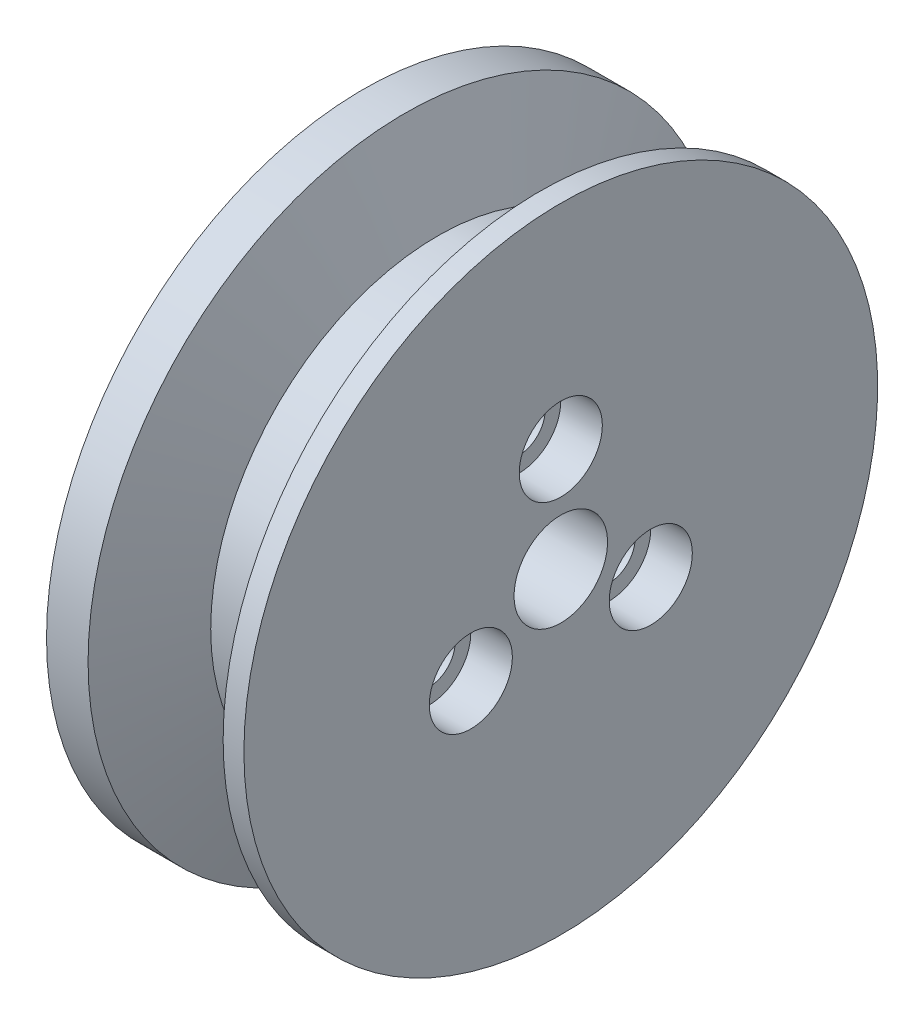
ISO-10303-21;
HEADER;
FILE_DESCRIPTION(('STEP AP214'),'2;1');
FILE_NAME('part.step','',(''),(''),'','','');
FILE_SCHEMA(('AUTOMOTIVE_DESIGN { 1 0 10303 214 1 1 1 1 }'));
ENDSEC;
DATA;
#1=APPLICATION_CONTEXT('core data for automotive mechanical design processes');
#2=APPLICATION_PROTOCOL_DEFINITION('international standard','automotive_design',2000,#1);
#3=PRODUCT_CONTEXT('',#1,'mechanical');
#4=PRODUCT('Part','Part','',(#3));
#5=PRODUCT_RELATED_PRODUCT_CATEGORY('part','',(#4));
#6=PRODUCT_DEFINITION_FORMATION('','',#4);
#7=PRODUCT_DEFINITION_CONTEXT('part definition',#1,'design');
#8=PRODUCT_DEFINITION('design','',#6,#7);
#9=PRODUCT_DEFINITION_SHAPE('','',#8);
#10=(LENGTH_UNIT() NAMED_UNIT(*) SI_UNIT(.MILLI.,.METRE.));
#11=(NAMED_UNIT(*) PLANE_ANGLE_UNIT() SI_UNIT($,.RADIAN.));
#12=(NAMED_UNIT(*) SI_UNIT($,.STERADIAN.) SOLID_ANGLE_UNIT());
#13=UNCERTAINTY_MEASURE_WITH_UNIT(LENGTH_MEASURE(1.E-05),#10,'distance_accuracy_value','');
#14=(GEOMETRIC_REPRESENTATION_CONTEXT(3) GLOBAL_UNCERTAINTY_ASSIGNED_CONTEXT((#13)) GLOBAL_UNIT_ASSIGNED_CONTEXT((#10,
#11,#12)) REPRESENTATION_CONTEXT('',''));
#15=CARTESIAN_POINT('',(0.,0.,0.));
#16=DIRECTION('',(0.,0.,1.));
#17=DIRECTION('',(1.,0.,0.));
#18=AXIS2_PLACEMENT_3D('',#15,#16,#17);
#19=CARTESIAN_POINT('',(-8.24999999999999,21.05,28.));
#20=DIRECTION('',(-1.,0.,0.));
#21=DIRECTION('',(0.,0.,1.));
#22=AXIS2_PLACEMENT_3D('',#19,#20,#21);
#23=CYLINDRICAL_SURFACE('',#22,2.25);
#24=CARTESIAN_POINT('',(-2.5,21.05,28.));
#25=DIRECTION('',(-1.,0.,0.));
#26=DIRECTION('',(0.,0.,1.));
#27=AXIS2_PLACEMENT_3D('',#24,#25,#26);
#28=CIRCLE('',#27,2.25);
#29=CARTESIAN_POINT('',(-2.5,21.05,30.25));
#30=VERTEX_POINT('',#29);
#31=EDGE_CURVE('E10',#30,#30,#28,.T.);
#32=ORIENTED_EDGE('',*,*,#31,.F.);
#33=EDGE_LOOP('',(#32));
#34=FACE_BOUND('',#33,.T.);
#35=CARTESIAN_POINT('',(-8.24999999999999,21.05,28.));
#36=DIRECTION('',(-1.,0.,0.));
#37=DIRECTION('',(0.,0.,1.));
#38=AXIS2_PLACEMENT_3D('',#35,#36,#37);
#39=CIRCLE('',#38,2.25);
#40=CARTESIAN_POINT('',(-8.24999999999999,21.05,30.25));
#41=VERTEX_POINT('',#40);
#42=EDGE_CURVE('E57',#41,#41,#39,.T.);
#43=ORIENTED_EDGE('',*,*,#42,.T.);
#44=EDGE_LOOP('',(#43));
#45=FACE_BOUND('',#44,.T.);
#46=ADVANCED_FACE('F39',(#34,#45),#23,.F.);
#47=CARTESIAN_POINT('',(-2.5,21.05,25.75));
#48=DIRECTION('',(-1.,0.,0.));
#49=DIRECTION('',(0.,0.,1.));
#50=AXIS2_PLACEMENT_3D('',#47,#48,#49);
#51=PLANE('',#50);
#52=CARTESIAN_POINT('',(-2.49999999999999,26.05,28.));
#53=DIRECTION('',(1.,0.,0.));
#54=DIRECTION('',(0.,0.,-1.));
#55=AXIS2_PLACEMENT_3D('',#52,#53,#54);
#56=CIRCLE('',#55,2.);
#57=CARTESIAN_POINT('',(-2.49999999999999,26.05,26.));
#58=VERTEX_POINT('',#57);
#59=EDGE_CURVE('E206',#58,#58,#56,.T.);
#60=ORIENTED_EDGE('',*,*,#59,.F.);
#61=EDGE_LOOP('',(#60));
#62=FACE_BOUND('',#61,.T.);
#63=CARTESIAN_POINT('',(-2.49999999999999,18.55,23.6698729810778));
#64=DIRECTION('',(1.,0.,0.));
#65=DIRECTION('',(0.,0.,-1.));
#66=AXIS2_PLACEMENT_3D('',#63,#64,#65);
#67=CIRCLE('',#66,2.);
#68=CARTESIAN_POINT('',(-2.49999999999999,18.55,21.6698729810778));
#69=VERTEX_POINT('',#68);
#70=EDGE_CURVE('E74',#69,#69,#67,.T.);
#71=ORIENTED_EDGE('',*,*,#70,.F.);
#72=EDGE_LOOP('',(#71));
#73=FACE_BOUND('',#72,.T.);
#74=CARTESIAN_POINT('',(-2.49999999999999,18.55,32.3301270189222));
#75=DIRECTION('',(1.,0.,0.));
#76=DIRECTION('',(0.,0.,-1.));
#77=AXIS2_PLACEMENT_3D('',#74,#75,#76);
#78=CIRCLE('',#77,2.);
#79=CARTESIAN_POINT('',(-2.49999999999999,18.55,30.3301270189222));
#80=VERTEX_POINT('',#79);
#81=EDGE_CURVE('E61',#80,#80,#78,.T.);
#82=ORIENTED_EDGE('',*,*,#81,.F.);
#83=EDGE_LOOP('',(#82));
#84=FACE_BOUND('',#83,.T.);
#85=CARTESIAN_POINT('',(-2.5,21.05,28.));
#86=DIRECTION('',(-1.,0.,0.));
#87=DIRECTION('',(0.,0.,1.));
#88=AXIS2_PLACEMENT_3D('',#85,#86,#87);
#89=CIRCLE('',#88,15.25);
#90=CARTESIAN_POINT('',(-2.50000000000001,21.05,43.25));
#91=VERTEX_POINT('',#90);
#92=EDGE_CURVE('E46',#91,#91,#89,.T.);
#93=ORIENTED_EDGE('',*,*,#92,.F.);
#94=EDGE_LOOP('',(#93));
#95=FACE_BOUND('',#94,.T.);
#96=ORIENTED_EDGE('',*,*,#31,.T.);
#97=EDGE_LOOP('',(#96));
#98=FACE_BOUND('',#97,.T.);
#99=ADVANCED_FACE('F115',(#62,#73,#84,#95,#98),#51,.F.);
#100=CARTESIAN_POINT('',(-8.24999999999999,21.05,28.));
#101=DIRECTION('',(-1.,0.,0.));
#102=DIRECTION('',(0.,0.,1.));
#103=AXIS2_PLACEMENT_3D('',#100,#101,#102);
#104=CYLINDRICAL_SURFACE('',#103,15.25);
#105=CARTESIAN_POINT('',(-3.5,21.05,28.));
#106=DIRECTION('',(-1.,0.,0.));
#107=DIRECTION('',(0.,0.,1.));
#108=AXIS2_PLACEMENT_3D('',#105,#106,#107);
#109=CIRCLE('',#108,15.25);
#110=CARTESIAN_POINT('',(-3.5,21.05,43.25));
#111=VERTEX_POINT('',#110);
#112=EDGE_CURVE('E51',#111,#111,#109,.T.);
#113=ORIENTED_EDGE('',*,*,#112,.F.);
#114=EDGE_LOOP('',(#113));
#115=FACE_BOUND('',#114,.T.);
#116=ORIENTED_EDGE('',*,*,#92,.T.);
#117=EDGE_LOOP('',(#116));
#118=FACE_BOUND('',#117,.T.);
#119=ADVANCED_FACE('F112',(#115,#118),#104,.T.);
#120=CARTESIAN_POINT('',(-3.5,21.05,28.));
#121=DIRECTION('',(1.,0.,0.));
#122=DIRECTION('',(0.,0.,-1.));
#123=AXIS2_PLACEMENT_3D('',#120,#121,#122);
#124=CONICAL_SURFACE('',#123,15.25,1.22173047639603);
#125=CARTESIAN_POINT('',(-5.075,21.05,28.));
#126=DIRECTION('',(-1.,0.,0.));
#127=DIRECTION('',(0.,0.,1.));
#128=AXIS2_PLACEMENT_3D('',#125,#126,#127);
#129=CIRCLE('',#128,10.9227230643589);
#130=CARTESIAN_POINT('',(-5.075,21.05,38.9227230643589));
#131=VERTEX_POINT('',#130);
#132=EDGE_CURVE('E105',#131,#131,#129,.T.);
#133=ORIENTED_EDGE('',*,*,#132,.F.);
#134=EDGE_LOOP('',(#133));
#135=FACE_BOUND('',#134,.T.);
#136=ORIENTED_EDGE('',*,*,#112,.T.);
#137=EDGE_LOOP('',(#136));
#138=FACE_BOUND('',#137,.T.);
#139=ADVANCED_FACE('F110',(#135,#138),#124,.T.);
#140=CARTESIAN_POINT('',(-8.24999999999999,21.05,28.));
#141=DIRECTION('',(-1.,0.,0.));
#142=DIRECTION('',(0.,0.,1.));
#143=AXIS2_PLACEMENT_3D('',#140,#141,#142);
#144=CYLINDRICAL_SURFACE('',#143,10.9227230643589);
#145=CARTESIAN_POINT('',(-8.425,21.05,28.));
#146=DIRECTION('',(-1.,0.,0.));
#147=DIRECTION('',(0.,0.,1.));
#148=AXIS2_PLACEMENT_3D('',#145,#146,#147);
#149=CIRCLE('',#148,10.9227230643589);
#150=CARTESIAN_POINT('',(-8.42500000000001,21.05,38.9227230643589));
#151=VERTEX_POINT('',#150);
#152=EDGE_CURVE('E102',#151,#151,#149,.T.);
#153=ORIENTED_EDGE('',*,*,#152,.F.);
#154=EDGE_LOOP('',(#153));
#155=FACE_BOUND('',#154,.T.);
#156=ORIENTED_EDGE('',*,*,#132,.T.);
#157=EDGE_LOOP('',(#156));
#158=FACE_BOUND('',#157,.T.);
#159=ADVANCED_FACE('F131',(#155,#158),#144,.T.);
#160=CARTESIAN_POINT('',(-8.425,21.05,28.));
#161=DIRECTION('',(-1.,0.,0.));
#162=DIRECTION('',(0.,0.,1.));
#163=AXIS2_PLACEMENT_3D('',#160,#161,#162);
#164=CONICAL_SURFACE('',#163,10.9227230643589,1.22173047639603);
#165=CARTESIAN_POINT('',(-10.,21.05,28.));
#166=DIRECTION('',(-1.,0.,0.));
#167=DIRECTION('',(0.,0.,1.));
#168=AXIS2_PLACEMENT_3D('',#165,#166,#167);
#169=CIRCLE('',#168,15.25);
#170=CARTESIAN_POINT('',(-10.,21.05,43.25));
#171=VERTEX_POINT('',#170);
#172=EDGE_CURVE('E99',#171,#171,#169,.T.);
#173=ORIENTED_EDGE('',*,*,#172,.F.);
#174=EDGE_LOOP('',(#173));
#175=FACE_BOUND('',#174,.T.);
#176=ORIENTED_EDGE('',*,*,#152,.T.);
#177=EDGE_LOOP('',(#176));
#178=FACE_BOUND('',#177,.T.);
#179=ADVANCED_FACE('F135',(#175,#178),#164,.T.);
#180=CARTESIAN_POINT('',(-8.24999999999999,21.05,28.));
#181=DIRECTION('',(-1.,0.,0.));
#182=DIRECTION('',(0.,0.,1.));
#183=AXIS2_PLACEMENT_3D('',#180,#181,#182);
#184=CYLINDRICAL_SURFACE('',#183,15.25);
#185=CARTESIAN_POINT('',(-12.,21.05,28.));
#186=DIRECTION('',(-1.,0.,0.));
#187=DIRECTION('',(0.,0.,1.));
#188=AXIS2_PLACEMENT_3D('',#185,#186,#187);
#189=CIRCLE('',#188,15.25);
#190=CARTESIAN_POINT('',(-12.,21.05,43.25));
#191=VERTEX_POINT('',#190);
#192=EDGE_CURVE('E96',#191,#191,#189,.T.);
#193=ORIENTED_EDGE('',*,*,#192,.F.);
#194=EDGE_LOOP('',(#193));
#195=FACE_BOUND('',#194,.T.);
#196=ORIENTED_EDGE('',*,*,#172,.T.);
#197=EDGE_LOOP('',(#196));
#198=FACE_BOUND('',#197,.T.);
#199=ADVANCED_FACE('F139',(#195,#198),#184,.T.);
#200=CARTESIAN_POINT('',(-12.,21.05,12.75));
#201=DIRECTION('',(1.,0.,0.));
#202=DIRECTION('',(0.,0.,-1.));
#203=AXIS2_PLACEMENT_3D('',#200,#201,#202);
#204=PLANE('',#203);
#205=CARTESIAN_POINT('',(-12.,21.05,28.));
#206=DIRECTION('',(-1.,0.,0.));
#207=DIRECTION('',(0.,0.,1.));
#208=AXIS2_PLACEMENT_3D('',#205,#206,#207);
#209=CIRCLE('',#208,12.3);
#210=CARTESIAN_POINT('',(-12.,21.05,40.3));
#211=VERTEX_POINT('',#210);
#212=EDGE_CURVE('E93',#211,#211,#209,.T.);
#213=ORIENTED_EDGE('',*,*,#212,.F.);
#214=EDGE_LOOP('',(#213));
#215=FACE_BOUND('',#214,.T.);
#216=ORIENTED_EDGE('',*,*,#192,.T.);
#217=EDGE_LOOP('',(#216));
#218=FACE_BOUND('',#217,.T.);
#219=ADVANCED_FACE('F143',(#215,#218),#204,.F.);
#220=CARTESIAN_POINT('',(-12.,21.05,28.));
#221=DIRECTION('',(-1.,0.,0.));
#222=DIRECTION('',(0.,0.,1.));
#223=AXIS2_PLACEMENT_3D('',#220,#221,#222);
#224=CONICAL_SURFACE('',#223,12.3,0.785398163397446);
#225=CARTESIAN_POINT('',(-9.49999999999999,21.05,28.));
#226=DIRECTION('',(-1.,0.,0.));
#227=DIRECTION('',(0.,0.,1.));
#228=AXIS2_PLACEMENT_3D('',#225,#226,#227);
#229=CIRCLE('',#228,9.8);
#230=CARTESIAN_POINT('',(-9.5,21.05,37.8));
#231=VERTEX_POINT('',#230);
#232=EDGE_CURVE('E90',#231,#231,#229,.T.);
#233=ORIENTED_EDGE('',*,*,#232,.F.);
#234=EDGE_LOOP('',(#233));
#235=FACE_BOUND('',#234,.T.);
#236=ORIENTED_EDGE('',*,*,#212,.T.);
#237=EDGE_LOOP('',(#236));
#238=FACE_BOUND('',#237,.T.);
#239=ADVANCED_FACE('F147',(#235,#238),#224,.F.);
#240=CARTESIAN_POINT('',(-9.49999999999999,21.05,21.25));
#241=DIRECTION('',(1.,0.,0.));
#242=DIRECTION('',(0.,0.,-1.));
#243=AXIS2_PLACEMENT_3D('',#240,#241,#242);
#244=PLANE('',#243);
#245=CARTESIAN_POINT('',(-9.49999999999999,21.05,28.));
#246=DIRECTION('',(-1.,0.,0.));
#247=DIRECTION('',(0.,0.,1.));
#248=AXIS2_PLACEMENT_3D('',#245,#246,#247);
#249=CIRCLE('',#248,6.75);
#250=CARTESIAN_POINT('',(-9.5,21.05,34.75));
#251=VERTEX_POINT('',#250);
#252=EDGE_CURVE('E87',#251,#251,#249,.T.);
#253=ORIENTED_EDGE('',*,*,#252,.F.);
#254=EDGE_LOOP('',(#253));
#255=FACE_BOUND('',#254,.T.);
#256=ORIENTED_EDGE('',*,*,#232,.T.);
#257=EDGE_LOOP('',(#256));
#258=FACE_BOUND('',#257,.T.);
#259=ADVANCED_FACE('F151',(#255,#258),#244,.F.);
#260=CARTESIAN_POINT('',(-8.24999999999999,21.05,28.));
#261=DIRECTION('',(-1.,0.,0.));
#262=DIRECTION('',(0.,0.,1.));
#263=AXIS2_PLACEMENT_3D('',#260,#261,#262);
#264=CYLINDRICAL_SURFACE('',#263,6.75);
#265=CARTESIAN_POINT('',(-8.24999999999999,21.05,28.));
#266=DIRECTION('',(-1.,0.,0.));
#267=DIRECTION('',(0.,0.,1.));
#268=AXIS2_PLACEMENT_3D('',#265,#266,#267);
#269=CIRCLE('',#268,6.75);
#270=CARTESIAN_POINT('',(-8.25,21.05,34.75));
#271=VERTEX_POINT('',#270);
#272=EDGE_CURVE('E84',#271,#271,#269,.T.);
#273=ORIENTED_EDGE('',*,*,#272,.F.);
#274=EDGE_LOOP('',(#273));
#275=FACE_BOUND('',#274,.T.);
#276=ORIENTED_EDGE('',*,*,#252,.T.);
#277=EDGE_LOOP('',(#276));
#278=FACE_BOUND('',#277,.T.);
#279=ADVANCED_FACE('F155',(#275,#278),#264,.F.);
#280=CARTESIAN_POINT('',(-8.24999999999999,21.05,21.25));
#281=DIRECTION('',(1.,0.,0.));
#282=DIRECTION('',(0.,0.,-1.));
#283=AXIS2_PLACEMENT_3D('',#280,#281,#282);
#284=PLANE('',#283);
#285=CARTESIAN_POINT('',(-8.24999999999999,26.05,28.));
#286=DIRECTION('',(1.,0.,0.));
#287=DIRECTION('',(0.,0.,-1.));
#288=AXIS2_PLACEMENT_3D('',#285,#286,#287);
#289=CIRCLE('',#288,1.24999999999999);
#290=CARTESIAN_POINT('',(-8.24999999999999,26.05,26.75));
#291=VERTEX_POINT('',#290);
#292=EDGE_CURVE('E42',#291,#291,#289,.T.);
#293=ORIENTED_EDGE('',*,*,#292,.T.);
#294=EDGE_LOOP('',(#293));
#295=FACE_BOUND('',#294,.T.);
#296=CARTESIAN_POINT('',(-8.24999999999999,18.55,23.6698729810778));
#297=DIRECTION('',(1.,0.,0.));
#298=DIRECTION('',(0.,0.,-1.));
#299=AXIS2_PLACEMENT_3D('',#296,#297,#298);
#300=CIRCLE('',#299,1.24999999999999);
#301=CARTESIAN_POINT('',(-8.24999999999999,18.55,22.4198729810778));
#302=VERTEX_POINT('',#301);
#303=EDGE_CURVE('E59',#302,#302,#300,.T.);
#304=ORIENTED_EDGE('',*,*,#303,.T.);
#305=EDGE_LOOP('',(#304));
#306=FACE_BOUND('',#305,.T.);
#307=CARTESIAN_POINT('',(-8.25,18.55,32.3301270189222));
#308=DIRECTION('',(1.,0.,0.));
#309=DIRECTION('',(0.,0.,-1.));
#310=AXIS2_PLACEMENT_3D('',#307,#308,#309);
#311=CIRCLE('',#310,1.24999999999999);
#312=CARTESIAN_POINT('',(-8.25,18.55,31.0801270189222));
#313=VERTEX_POINT('',#312);
#314=EDGE_CURVE('E55',#313,#313,#311,.T.);
#315=ORIENTED_EDGE('',*,*,#314,.T.);
#316=EDGE_LOOP('',(#315));
#317=FACE_BOUND('',#316,.T.);
#318=ORIENTED_EDGE('',*,*,#42,.F.);
#319=EDGE_LOOP('',(#318));
#320=FACE_BOUND('',#319,.T.);
#321=ORIENTED_EDGE('',*,*,#272,.T.);
#322=EDGE_LOOP('',(#321));
#323=FACE_BOUND('',#322,.T.);
#324=ADVANCED_FACE('F159',(#295,#306,#317,#320,#323),#284,.F.);
#325=CARTESIAN_POINT('',(-2.49999999999999,18.55,32.3301270189222));
#326=DIRECTION('',(1.,0.,0.));
#327=DIRECTION('',(0.,0.,-1.));
#328=AXIS2_PLACEMENT_3D('',#325,#326,#327);
#329=CYLINDRICAL_SURFACE('',#328,1.24999999999999);
#330=CARTESIAN_POINT('',(-4.49999999999999,18.55,32.3301270189222));
#331=DIRECTION('',(1.,0.,0.));
#332=DIRECTION('',(0.,0.,-1.));
#333=AXIS2_PLACEMENT_3D('',#330,#331,#332);
#334=CIRCLE('',#333,1.25000000000001);
#335=CARTESIAN_POINT('',(-4.49999999999999,18.55,31.0801270189222));
#336=VERTEX_POINT('',#335);
#337=EDGE_CURVE('E58',#336,#336,#334,.T.);
#338=ORIENTED_EDGE('',*,*,#337,.T.);
#339=EDGE_LOOP('',(#338));
#340=FACE_BOUND('',#339,.T.);
#341=ORIENTED_EDGE('',*,*,#314,.F.);
#342=EDGE_LOOP('',(#341));
#343=FACE_BOUND('',#342,.T.);
#344=ADVANCED_FACE('F163',(#340,#343),#329,.F.);
#345=CARTESIAN_POINT('',(-4.49999999999999,19.8,32.3301270189222));
#346=DIRECTION('',(-1.,0.,0.));
#347=DIRECTION('',(0.,0.,1.));
#348=AXIS2_PLACEMENT_3D('',#345,#346,#347);
#349=PLANE('',#348);
#350=ORIENTED_EDGE('',*,*,#337,.F.);
#351=EDGE_LOOP('',(#350));
#352=FACE_BOUND('',#351,.T.);
#353=CARTESIAN_POINT('',(-4.49999999999999,18.55,32.3301270189222));
#354=DIRECTION('',(1.,0.,0.));
#355=DIRECTION('',(0.,0.,-1.));
#356=AXIS2_PLACEMENT_3D('',#353,#354,#355);
#357=CIRCLE('',#356,2.);
#358=CARTESIAN_POINT('',(-4.49999999999999,18.55,30.3301270189222));
#359=VERTEX_POINT('',#358);
#360=EDGE_CURVE('E66',#359,#359,#357,.T.);
#361=ORIENTED_EDGE('',*,*,#360,.T.);
#362=EDGE_LOOP('',(#361));
#363=FACE_BOUND('',#362,.T.);
#364=ADVANCED_FACE('F167',(#352,#363),#349,.F.);
#365=CARTESIAN_POINT('',(-2.49999999999999,18.55,32.3301270189222));
#366=DIRECTION('',(1.,0.,0.));
#367=DIRECTION('',(0.,0.,-1.));
#368=AXIS2_PLACEMENT_3D('',#365,#366,#367);
#369=CYLINDRICAL_SURFACE('',#368,2.);
#370=ORIENTED_EDGE('',*,*,#360,.F.);
#371=EDGE_LOOP('',(#370));
#372=FACE_BOUND('',#371,.T.);
#373=ORIENTED_EDGE('',*,*,#81,.T.);
#374=EDGE_LOOP('',(#373));
#375=FACE_BOUND('',#374,.T.);
#376=ADVANCED_FACE('F171',(#372,#375),#369,.F.);
#377=CARTESIAN_POINT('',(-2.49999999999999,18.55,23.6698729810778));
#378=DIRECTION('',(1.,0.,0.));
#379=DIRECTION('',(0.,0.,-1.));
#380=AXIS2_PLACEMENT_3D('',#377,#378,#379);
#381=CYLINDRICAL_SURFACE('',#380,1.24999999999999);
#382=CARTESIAN_POINT('',(-4.49999999999999,18.55,23.6698729810778));
#383=DIRECTION('',(1.,0.,0.));
#384=DIRECTION('',(0.,0.,-1.));
#385=AXIS2_PLACEMENT_3D('',#382,#383,#384);
#386=CIRCLE('',#385,1.25000000000001);
#387=CARTESIAN_POINT('',(-4.49999999999999,18.55,22.4198729810778));
#388=VERTEX_POINT('',#387);
#389=EDGE_CURVE('E62',#388,#388,#386,.T.);
#390=ORIENTED_EDGE('',*,*,#389,.T.);
#391=EDGE_LOOP('',(#390));
#392=FACE_BOUND('',#391,.T.);
#393=ORIENTED_EDGE('',*,*,#303,.F.);
#394=EDGE_LOOP('',(#393));
#395=FACE_BOUND('',#394,.T.);
#396=ADVANCED_FACE('F175',(#392,#395),#381,.F.);
#397=CARTESIAN_POINT('',(-4.49999999999999,19.8,23.6698729810778));
#398=DIRECTION('',(-1.,0.,0.));
#399=DIRECTION('',(0.,0.,1.));
#400=AXIS2_PLACEMENT_3D('',#397,#398,#399);
#401=PLANE('',#400);
#402=ORIENTED_EDGE('',*,*,#389,.F.);
#403=EDGE_LOOP('',(#402));
#404=FACE_BOUND('',#403,.T.);
#405=CARTESIAN_POINT('',(-4.49999999999999,18.55,23.6698729810778));
#406=DIRECTION('',(1.,0.,0.));
#407=DIRECTION('',(0.,0.,-1.));
#408=AXIS2_PLACEMENT_3D('',#405,#406,#407);
#409=CIRCLE('',#408,2.);
#410=CARTESIAN_POINT('',(-4.49999999999999,18.55,21.6698729810778));
#411=VERTEX_POINT('',#410);
#412=EDGE_CURVE('E69',#411,#411,#409,.T.);
#413=ORIENTED_EDGE('',*,*,#412,.T.);
#414=EDGE_LOOP('',(#413));
#415=FACE_BOUND('',#414,.T.);
#416=ADVANCED_FACE('F179',(#404,#415),#401,.F.);
#417=CARTESIAN_POINT('',(-2.49999999999999,18.55,23.6698729810778));
#418=DIRECTION('',(1.,0.,0.));
#419=DIRECTION('',(0.,0.,-1.));
#420=AXIS2_PLACEMENT_3D('',#417,#418,#419);
#421=CYLINDRICAL_SURFACE('',#420,2.);
#422=ORIENTED_EDGE('',*,*,#412,.F.);
#423=EDGE_LOOP('',(#422));
#424=FACE_BOUND('',#423,.T.);
#425=ORIENTED_EDGE('',*,*,#70,.T.);
#426=EDGE_LOOP('',(#425));
#427=FACE_BOUND('',#426,.T.);
#428=ADVANCED_FACE('F182',(#424,#427),#421,.F.);
#429=CARTESIAN_POINT('',(-2.49999999999999,26.05,28.));
#430=DIRECTION('',(1.,0.,0.));
#431=DIRECTION('',(0.,0.,-1.));
#432=AXIS2_PLACEMENT_3D('',#429,#430,#431);
#433=CYLINDRICAL_SURFACE('',#432,1.24999999999999);
#434=CARTESIAN_POINT('',(-4.49999999999999,26.05,28.));
#435=DIRECTION('',(1.,0.,0.));
#436=DIRECTION('',(0.,0.,-1.));
#437=AXIS2_PLACEMENT_3D('',#434,#435,#436);
#438=CIRCLE('',#437,1.25000000000001);
#439=CARTESIAN_POINT('',(-4.49999999999999,26.05,26.75));
#440=VERTEX_POINT('',#439);
#441=EDGE_CURVE('E208',#440,#440,#438,.T.);
#442=ORIENTED_EDGE('',*,*,#441,.T.);
#443=EDGE_LOOP('',(#442));
#444=FACE_BOUND('',#443,.T.);
#445=ORIENTED_EDGE('',*,*,#292,.F.);
#446=EDGE_LOOP('',(#445));
#447=FACE_BOUND('',#446,.T.);
#448=ADVANCED_FACE('F186',(#444,#447),#433,.F.);
#449=CARTESIAN_POINT('',(-4.49999999999999,27.3,28.));
#450=DIRECTION('',(-1.,0.,0.));
#451=DIRECTION('',(0.,0.,1.));
#452=AXIS2_PLACEMENT_3D('',#449,#450,#451);
#453=PLANE('',#452);
#454=ORIENTED_EDGE('',*,*,#441,.F.);
#455=EDGE_LOOP('',(#454));
#456=FACE_BOUND('',#455,.T.);
#457=CARTESIAN_POINT('',(-4.49999999999999,26.05,28.));
#458=DIRECTION('',(1.,0.,0.));
#459=DIRECTION('',(0.,0.,-1.));
#460=AXIS2_PLACEMENT_3D('',#457,#458,#459);
#461=CIRCLE('',#460,2.);
#462=CARTESIAN_POINT('',(-4.49999999999999,26.05,26.));
#463=VERTEX_POINT('',#462);
#464=EDGE_CURVE('E204',#463,#463,#461,.T.);
#465=ORIENTED_EDGE('',*,*,#464,.T.);
#466=EDGE_LOOP('',(#465));
#467=FACE_BOUND('',#466,.T.);
#468=ADVANCED_FACE('F190',(#456,#467),#453,.F.);
#469=CARTESIAN_POINT('',(-2.49999999999999,26.05,28.));
#470=DIRECTION('',(1.,0.,0.));
#471=DIRECTION('',(0.,0.,-1.));
#472=AXIS2_PLACEMENT_3D('',#469,#470,#471);
#473=CYLINDRICAL_SURFACE('',#472,2.);
#474=ORIENTED_EDGE('',*,*,#464,.F.);
#475=EDGE_LOOP('',(#474));
#476=FACE_BOUND('',#475,.T.);
#477=ORIENTED_EDGE('',*,*,#59,.T.);
#478=EDGE_LOOP('',(#477));
#479=FACE_BOUND('',#478,.T.);
#480=ADVANCED_FACE('F194',(#476,#479),#473,.F.);
#481=CLOSED_SHELL('',(#46,#99,#119,#139,#159,#179,#199,#219,#239,#259,#279,#324,#344,#364,#376,
#396,#416,#428,#448,#468,#480));
#482=MANIFOLD_SOLID_BREP('B2',#481);
#483=ADVANCED_BREP_SHAPE_REPRESENTATION('',(#18,#482),#14);
#484=SHAPE_DEFINITION_REPRESENTATION(#9,#483);
ENDSEC;
END-ISO-10303-21;
